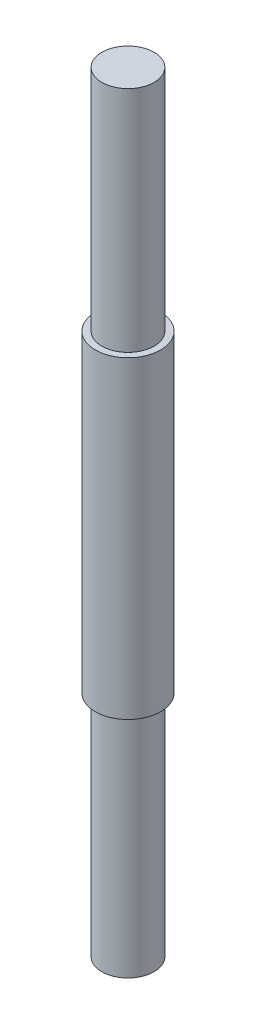
ISO-10303-21;
HEADER;
FILE_DESCRIPTION(('STEP AP214'),'2;1');
FILE_NAME('part.step','',(''),(''),'','','');
FILE_SCHEMA(('AUTOMOTIVE_DESIGN { 1 0 10303 214 1 1 1 1 }'));
ENDSEC;
DATA;
#1=APPLICATION_CONTEXT('core data for automotive mechanical design processes');
#2=APPLICATION_PROTOCOL_DEFINITION('international standard','automotive_design',2000,#1);
#3=PRODUCT_CONTEXT('',#1,'mechanical');
#4=PRODUCT('Part','Part','',(#3));
#5=PRODUCT_RELATED_PRODUCT_CATEGORY('part','',(#4));
#6=PRODUCT_DEFINITION_FORMATION('','',#4);
#7=PRODUCT_DEFINITION_CONTEXT('part definition',#1,'design');
#8=PRODUCT_DEFINITION('design','',#6,#7);
#9=PRODUCT_DEFINITION_SHAPE('','',#8);
#10=(LENGTH_UNIT() NAMED_UNIT(*) SI_UNIT(.MILLI.,.METRE.));
#11=(NAMED_UNIT(*) PLANE_ANGLE_UNIT() SI_UNIT($,.RADIAN.));
#12=(NAMED_UNIT(*) SI_UNIT($,.STERADIAN.) SOLID_ANGLE_UNIT());
#13=UNCERTAINTY_MEASURE_WITH_UNIT(LENGTH_MEASURE(1.E-05),#10,'distance_accuracy_value','');
#14=(GEOMETRIC_REPRESENTATION_CONTEXT(3) GLOBAL_UNCERTAINTY_ASSIGNED_CONTEXT((#13)) GLOBAL_UNIT_ASSIGNED_CONTEXT((#10,
#11,#12)) REPRESENTATION_CONTEXT('',''));
#15=CARTESIAN_POINT('',(0.,0.,0.));
#16=DIRECTION('',(0.,0.,1.));
#17=DIRECTION('',(1.,0.,0.));
#18=AXIS2_PLACEMENT_3D('',#15,#16,#17);
#19=CARTESIAN_POINT('',(0.,48.,0.));
#20=DIRECTION('',(0.,-1.,0.));
#21=DIRECTION('',(0.,0.,-1.));
#22=AXIS2_PLACEMENT_3D('',#19,#20,#21);
#23=CYLINDRICAL_SURFACE('',#22,5.);
#24=CARTESIAN_POINT('',(0.,48.,0.));
#25=DIRECTION('',(0.,1.,0.));
#26=DIRECTION('',(0.,0.,1.));
#27=AXIS2_PLACEMENT_3D('',#24,#25,#26);
#28=CIRCLE('',#27,5.);
#29=CARTESIAN_POINT('',(0.,48.,5.));
#30=VERTEX_POINT('',#29);
#31=EDGE_CURVE('E41',#30,#30,#28,.T.);
#32=ORIENTED_EDGE('',*,*,#31,.F.);
#33=EDGE_LOOP('',(#32));
#34=FACE_BOUND('',#33,.T.);
#35=CARTESIAN_POINT('',(0.,0.,0.));
#36=DIRECTION('',(0.,1.,0.));
#37=DIRECTION('',(0.,0.,1.));
#38=AXIS2_PLACEMENT_3D('',#35,#36,#37);
#39=CIRCLE('',#38,5.);
#40=CARTESIAN_POINT('',(0.,0.,5.));
#41=VERTEX_POINT('',#40);
#42=EDGE_CURVE('E45',#41,#41,#39,.T.);
#43=ORIENTED_EDGE('',*,*,#42,.T.);
#44=EDGE_LOOP('',(#43));
#45=FACE_BOUND('',#44,.T.);
#46=ADVANCED_FACE('F35',(#34,#45),#23,.T.);
#47=CARTESIAN_POINT('',(0.,48.,0.));
#48=DIRECTION('',(0.,1.,0.));
#49=DIRECTION('',(0.,0.,1.));
#50=AXIS2_PLACEMENT_3D('',#47,#48,#49);
#51=PLANE('',#50);
#52=CARTESIAN_POINT('',(0.,48.,0.));
#53=DIRECTION('',(0.,1.,0.));
#54=DIRECTION('',(0.,0.,1.));
#55=AXIS2_PLACEMENT_3D('',#52,#53,#54);
#56=CIRCLE('',#55,4.);
#57=CARTESIAN_POINT('',(0.,48.,4.));
#58=VERTEX_POINT('',#57);
#59=EDGE_CURVE('E55',#58,#58,#56,.T.);
#60=ORIENTED_EDGE('',*,*,#59,.F.);
#61=EDGE_LOOP('',(#60));
#62=FACE_BOUND('',#61,.T.);
#63=ORIENTED_EDGE('',*,*,#31,.T.);
#64=EDGE_LOOP('',(#63));
#65=FACE_BOUND('',#64,.T.);
#66=ADVANCED_FACE('F70',(#62,#65),#51,.T.);
#67=CARTESIAN_POINT('',(0.,0.,0.));
#68=DIRECTION('',(0.,1.,0.));
#69=DIRECTION('',(0.,0.,1.));
#70=AXIS2_PLACEMENT_3D('',#67,#68,#69);
#71=PLANE('',#70);
#72=CARTESIAN_POINT('',(0.,0.,0.));
#73=DIRECTION('',(0.,1.,0.));
#74=DIRECTION('',(0.,0.,1.));
#75=AXIS2_PLACEMENT_3D('',#72,#73,#74);
#76=CIRCLE('',#75,4.);
#77=CARTESIAN_POINT('',(0.,0.,4.));
#78=VERTEX_POINT('',#77);
#79=EDGE_CURVE('E10',#78,#78,#76,.F.);
#80=ORIENTED_EDGE('',*,*,#79,.F.);
#81=EDGE_LOOP('',(#80));
#82=FACE_BOUND('',#81,.T.);
#83=ORIENTED_EDGE('',*,*,#42,.F.);
#84=EDGE_LOOP('',(#83));
#85=FACE_BOUND('',#84,.T.);
#86=ADVANCED_FACE('F72',(#82,#85),#71,.F.);
#87=CARTESIAN_POINT('',(0.,-35.,0.));
#88=DIRECTION('',(0.,1.,0.));
#89=DIRECTION('',(0.,0.,1.));
#90=AXIS2_PLACEMENT_3D('',#87,#88,#89);
#91=CYLINDRICAL_SURFACE('',#90,4.);
#92=CARTESIAN_POINT('',(0.,-35.,0.));
#93=DIRECTION('',(0.,-1.,0.));
#94=DIRECTION('',(0.,0.,-1.));
#95=AXIS2_PLACEMENT_3D('',#92,#93,#94);
#96=CIRCLE('',#95,4.);
#97=CARTESIAN_POINT('',(0.,-35.,-4.));
#98=VERTEX_POINT('',#97);
#99=EDGE_CURVE('E50',#98,#98,#96,.T.);
#100=ORIENTED_EDGE('',*,*,#99,.F.);
#101=EDGE_LOOP('',(#100));
#102=FACE_BOUND('',#101,.T.);
#103=ORIENTED_EDGE('',*,*,#79,.T.);
#104=EDGE_LOOP('',(#103));
#105=FACE_BOUND('',#104,.T.);
#106=ADVANCED_FACE('F78',(#102,#105),#91,.T.);
#107=CARTESIAN_POINT('',(0.,-35.,0.));
#108=DIRECTION('',(0.,-1.,0.));
#109=DIRECTION('',(0.,0.,-1.));
#110=AXIS2_PLACEMENT_3D('',#107,#108,#109);
#111=PLANE('',#110);
#112=ORIENTED_EDGE('',*,*,#99,.T.);
#113=EDGE_LOOP('',(#112));
#114=FACE_BOUND('',#113,.T.);
#115=ADVANCED_FACE('F66',(#114),#111,.T.);
#116=CARTESIAN_POINT('',(0.,83.,0.));
#117=DIRECTION('',(0.,-1.,0.));
#118=DIRECTION('',(0.,0.,-1.));
#119=AXIS2_PLACEMENT_3D('',#116,#117,#118);
#120=CYLINDRICAL_SURFACE('',#119,4.);
#121=CARTESIAN_POINT('',(0.,83.,0.));
#122=DIRECTION('',(0.,1.,0.));
#123=DIRECTION('',(0.,0.,1.));
#124=AXIS2_PLACEMENT_3D('',#121,#122,#123);
#125=CIRCLE('',#124,4.);
#126=CARTESIAN_POINT('',(0.,83.,4.));
#127=VERTEX_POINT('',#126);
#128=EDGE_CURVE('E54',#127,#127,#125,.T.);
#129=ORIENTED_EDGE('',*,*,#128,.F.);
#130=EDGE_LOOP('',(#129));
#131=FACE_BOUND('',#130,.T.);
#132=ORIENTED_EDGE('',*,*,#59,.T.);
#133=EDGE_LOOP('',(#132));
#134=FACE_BOUND('',#133,.T.);
#135=ADVANCED_FACE('F63',(#131,#134),#120,.T.);
#136=CARTESIAN_POINT('',(0.,83.,0.));
#137=DIRECTION('',(0.,1.,0.));
#138=DIRECTION('',(0.,0.,1.));
#139=AXIS2_PLACEMENT_3D('',#136,#137,#138);
#140=PLANE('',#139);
#141=ORIENTED_EDGE('',*,*,#128,.T.);
#142=EDGE_LOOP('',(#141));
#143=FACE_BOUND('',#142,.T.);
#144=ADVANCED_FACE('F61',(#143),#140,.T.);
#145=CLOSED_SHELL('',(#46,#66,#86,#106,#115,#135,#144));
#146=MANIFOLD_SOLID_BREP('B2',#145);
#147=ADVANCED_BREP_SHAPE_REPRESENTATION('',(#18,#146),#14);
#148=SHAPE_DEFINITION_REPRESENTATION(#9,#147);
ENDSEC;
END-ISO-10303-21;
